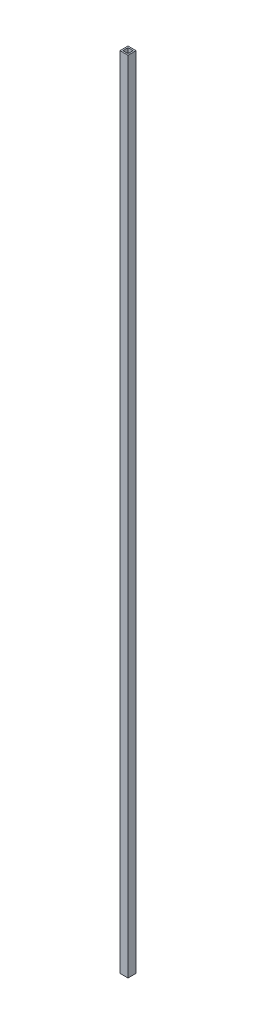
ISO-10303-21;
HEADER;
FILE_DESCRIPTION(('STEP AP214'),'2;1');
FILE_NAME('part.step','',(''),(''),'','','');
FILE_SCHEMA(('AUTOMOTIVE_DESIGN { 1 0 10303 214 1 1 1 1 }'));
ENDSEC;
DATA;
#1=APPLICATION_CONTEXT('core data for automotive mechanical design processes');
#2=APPLICATION_PROTOCOL_DEFINITION('international standard','automotive_design',2000,#1);
#3=PRODUCT_CONTEXT('',#1,'mechanical');
#4=PRODUCT('Part','Part','',(#3));
#5=PRODUCT_RELATED_PRODUCT_CATEGORY('part','',(#4));
#6=PRODUCT_DEFINITION_FORMATION('','',#4);
#7=PRODUCT_DEFINITION_CONTEXT('part definition',#1,'design');
#8=PRODUCT_DEFINITION('design','',#6,#7);
#9=PRODUCT_DEFINITION_SHAPE('','',#8);
#10=(LENGTH_UNIT() NAMED_UNIT(*) SI_UNIT(.MILLI.,.METRE.));
#11=(NAMED_UNIT(*) PLANE_ANGLE_UNIT() SI_UNIT($,.RADIAN.));
#12=(NAMED_UNIT(*) SI_UNIT($,.STERADIAN.) SOLID_ANGLE_UNIT());
#13=UNCERTAINTY_MEASURE_WITH_UNIT(LENGTH_MEASURE(1.E-05),#10,'distance_accuracy_value','');
#14=(GEOMETRIC_REPRESENTATION_CONTEXT(3) GLOBAL_UNCERTAINTY_ASSIGNED_CONTEXT((#13)) GLOBAL_UNIT_ASSIGNED_CONTEXT((#10,
#11,#12)) REPRESENTATION_CONTEXT('',''));
#15=CARTESIAN_POINT('',(0.,0.,0.));
#16=DIRECTION('',(0.,0.,1.));
#17=DIRECTION('',(1.,0.,0.));
#18=AXIS2_PLACEMENT_3D('',#15,#16,#17);
#19=CARTESIAN_POINT('',(0.,1000.,0.));
#20=DIRECTION('',(0.,1.,0.));
#21=DIRECTION('',(0.,0.,1.));
#22=AXIS2_PLACEMENT_3D('',#19,#20,#21);
#23=PLANE('',#22);
#24=DIRECTION('',(0.,0.,-1.));
#25=VECTOR('',#24,1.);
#26=CARTESIAN_POINT('',(5.,1000.,-5.));
#27=LINE('',#26,#25);
#28=CARTESIAN_POINT('',(5.,1000.,5.));
#29=VERTEX_POINT('',#28);
#30=CARTESIAN_POINT('',(5.,1000.,-5.));
#31=VERTEX_POINT('',#30);
#32=EDGE_CURVE('E153',#29,#31,#27,.T.);
#33=ORIENTED_EDGE('',*,*,#32,.T.);
#34=DIRECTION('',(-1.,0.,0.));
#35=VECTOR('',#34,1.);
#36=CARTESIAN_POINT('',(-5.,1000.,-5.));
#37=LINE('',#36,#35);
#38=CARTESIAN_POINT('',(-5.,1000.,-5.));
#39=VERTEX_POINT('',#38);
#40=EDGE_CURVE('E157',#31,#39,#37,.T.);
#41=ORIENTED_EDGE('',*,*,#40,.T.);
#42=DIRECTION('',(0.,0.,1.));
#43=VECTOR('',#42,1.);
#44=CARTESIAN_POINT('',(-5.,1000.,-5.));
#45=LINE('',#44,#43);
#46=CARTESIAN_POINT('',(-5.,1000.,5.));
#47=VERTEX_POINT('',#46);
#48=EDGE_CURVE('E161',#39,#47,#45,.T.);
#49=ORIENTED_EDGE('',*,*,#48,.T.);
#50=DIRECTION('',(1.,0.,0.));
#51=VECTOR('',#50,1.);
#52=CARTESIAN_POINT('',(-5.,1000.,5.));
#53=LINE('',#52,#51);
#54=EDGE_CURVE('E164',#47,#29,#53,.T.);
#55=ORIENTED_EDGE('',*,*,#54,.T.);
#56=EDGE_LOOP('',(#33,#41,#49,#55));
#57=FACE_BOUND('',#56,.T.);
#58=DIRECTION('',(-1.,0.,0.));
#59=VECTOR('',#58,1.);
#60=CARTESIAN_POINT('',(-3.2,1000.,-3.2));
#61=LINE('',#60,#59);
#62=CARTESIAN_POINT('',(3.2,1000.,-3.2));
#63=VERTEX_POINT('',#62);
#64=CARTESIAN_POINT('',(-3.2,1000.,-3.2));
#65=VERTEX_POINT('',#64);
#66=EDGE_CURVE('E114',#63,#65,#61,.T.);
#67=ORIENTED_EDGE('',*,*,#66,.F.);
#68=DIRECTION('',(0.,0.,-1.));
#69=VECTOR('',#68,1.);
#70=CARTESIAN_POINT('',(3.2,1000.,-3.2));
#71=LINE('',#70,#69);
#72=CARTESIAN_POINT('',(3.2,1000.,3.2));
#73=VERTEX_POINT('',#72);
#74=EDGE_CURVE('E105',#73,#63,#71,.T.);
#75=ORIENTED_EDGE('',*,*,#74,.F.);
#76=DIRECTION('',(1.,0.,0.));
#77=VECTOR('',#76,1.);
#78=CARTESIAN_POINT('',(-3.2,1000.,3.2));
#79=LINE('',#78,#77);
#80=CARTESIAN_POINT('',(-3.2,1000.,3.2));
#81=VERTEX_POINT('',#80);
#82=EDGE_CURVE('E131',#81,#73,#79,.T.);
#83=ORIENTED_EDGE('',*,*,#82,.F.);
#84=DIRECTION('',(0.,0.,1.));
#85=VECTOR('',#84,1.);
#86=CARTESIAN_POINT('',(-3.2,1000.,-3.2));
#87=LINE('',#86,#85);
#88=EDGE_CURVE('E127',#65,#81,#87,.T.);
#89=ORIENTED_EDGE('',*,*,#88,.F.);
#90=EDGE_LOOP('',(#67,#75,#83,#89));
#91=FACE_BOUND('',#90,.T.);
#92=ADVANCED_FACE('F39',(#57,#91),#23,.T.);
#93=CARTESIAN_POINT('',(0.,0.,0.));
#94=DIRECTION('',(0.,1.,0.));
#95=DIRECTION('',(0.,0.,1.));
#96=AXIS2_PLACEMENT_3D('',#93,#94,#95);
#97=PLANE('',#96);
#98=DIRECTION('',(0.,0.,-1.));
#99=VECTOR('',#98,1.);
#100=CARTESIAN_POINT('',(5.,0.,-5.));
#101=LINE('',#100,#99);
#102=CARTESIAN_POINT('',(5.,0.,5.));
#103=VERTEX_POINT('',#102);
#104=CARTESIAN_POINT('',(5.,0.,-5.));
#105=VERTEX_POINT('',#104);
#106=EDGE_CURVE('E123',#103,#105,#101,.T.);
#107=ORIENTED_EDGE('',*,*,#106,.F.);
#108=DIRECTION('',(1.,0.,0.));
#109=VECTOR('',#108,1.);
#110=CARTESIAN_POINT('',(-5.,0.,5.));
#111=LINE('',#110,#109);
#112=CARTESIAN_POINT('',(-5.,0.,5.));
#113=VERTEX_POINT('',#112);
#114=EDGE_CURVE('E158',#113,#103,#111,.T.);
#115=ORIENTED_EDGE('',*,*,#114,.F.);
#116=DIRECTION('',(0.,0.,1.));
#117=VECTOR('',#116,1.);
#118=CARTESIAN_POINT('',(-5.,0.,-5.));
#119=LINE('',#118,#117);
#120=CARTESIAN_POINT('',(-5.,0.,-5.));
#121=VERTEX_POINT('',#120);
#122=EDGE_CURVE('E174',#121,#113,#119,.T.);
#123=ORIENTED_EDGE('',*,*,#122,.F.);
#124=DIRECTION('',(-1.,0.,0.));
#125=VECTOR('',#124,1.);
#126=CARTESIAN_POINT('',(-5.,0.,-5.));
#127=LINE('',#126,#125);
#128=EDGE_CURVE('E171',#105,#121,#127,.T.);
#129=ORIENTED_EDGE('',*,*,#128,.F.);
#130=EDGE_LOOP('',(#107,#115,#123,#129));
#131=FACE_BOUND('',#130,.T.);
#132=DIRECTION('',(0.,0.,-1.));
#133=VECTOR('',#132,1.);
#134=CARTESIAN_POINT('',(3.2,0.,-3.2));
#135=LINE('',#134,#133);
#136=CARTESIAN_POINT('',(3.2,0.,3.2));
#137=VERTEX_POINT('',#136);
#138=CARTESIAN_POINT('',(3.2,0.,-3.2));
#139=VERTEX_POINT('',#138);
#140=EDGE_CURVE('E63',#137,#139,#135,.T.);
#141=ORIENTED_EDGE('',*,*,#140,.T.);
#142=DIRECTION('',(-1.,0.,0.));
#143=VECTOR('',#142,1.);
#144=CARTESIAN_POINT('',(-3.2,0.,-3.2));
#145=LINE('',#144,#143);
#146=CARTESIAN_POINT('',(-3.2,0.,-3.2));
#147=VERTEX_POINT('',#146);
#148=EDGE_CURVE('E121',#139,#147,#145,.T.);
#149=ORIENTED_EDGE('',*,*,#148,.T.);
#150=DIRECTION('',(0.,0.,1.));
#151=VECTOR('',#150,1.);
#152=CARTESIAN_POINT('',(-3.2,0.,-3.2));
#153=LINE('',#152,#151);
#154=CARTESIAN_POINT('',(-3.2,0.,3.2));
#155=VERTEX_POINT('',#154);
#156=EDGE_CURVE('E140',#147,#155,#153,.T.);
#157=ORIENTED_EDGE('',*,*,#156,.T.);
#158=DIRECTION('',(1.,0.,0.));
#159=VECTOR('',#158,1.);
#160=CARTESIAN_POINT('',(-3.2,0.,3.2));
#161=LINE('',#160,#159);
#162=EDGE_CURVE('E115',#155,#137,#161,.T.);
#163=ORIENTED_EDGE('',*,*,#162,.T.);
#164=EDGE_LOOP('',(#141,#149,#157,#163));
#165=FACE_BOUND('',#164,.T.);
#166=ADVANCED_FACE('F197',(#131,#165),#97,.F.);
#167=CARTESIAN_POINT('',(5.,1000.,-5.));
#168=DIRECTION('',(-1.,0.,0.));
#169=DIRECTION('',(0.,0.,1.));
#170=AXIS2_PLACEMENT_3D('',#167,#168,#169);
#171=PLANE('',#170);
#172=ORIENTED_EDGE('',*,*,#106,.T.);
#173=DIRECTION('',(0.,-1.,0.));
#174=VECTOR('',#173,1.);
#175=CARTESIAN_POINT('',(5.,1000.,-5.));
#176=LINE('',#175,#174);
#177=EDGE_CURVE('E11',#31,#105,#176,.T.);
#178=ORIENTED_EDGE('',*,*,#177,.F.);
#179=ORIENTED_EDGE('',*,*,#32,.F.);
#180=DIRECTION('',(0.,-1.,0.));
#181=VECTOR('',#180,1.);
#182=CARTESIAN_POINT('',(5.,1000.,5.));
#183=LINE('',#182,#181);
#184=EDGE_CURVE('E167',#29,#103,#183,.T.);
#185=ORIENTED_EDGE('',*,*,#184,.T.);
#186=EDGE_LOOP('',(#172,#178,#179,#185));
#187=FACE_BOUND('',#186,.T.);
#188=ADVANCED_FACE('F41',(#187),#171,.F.);
#189=CARTESIAN_POINT('',(-5.,1000.,-5.));
#190=DIRECTION('',(0.,0.,1.));
#191=DIRECTION('',(1.,0.,0.));
#192=AXIS2_PLACEMENT_3D('',#189,#190,#191);
#193=PLANE('',#192);
#194=ORIENTED_EDGE('',*,*,#128,.T.);
#195=DIRECTION('',(0.,-1.,0.));
#196=VECTOR('',#195,1.);
#197=CARTESIAN_POINT('',(-5.,1000.,-5.));
#198=LINE('',#197,#196);
#199=EDGE_CURVE('E48',#39,#121,#198,.T.);
#200=ORIENTED_EDGE('',*,*,#199,.F.);
#201=ORIENTED_EDGE('',*,*,#40,.F.);
#202=ORIENTED_EDGE('',*,*,#177,.T.);
#203=EDGE_LOOP('',(#194,#200,#201,#202));
#204=FACE_BOUND('',#203,.T.);
#205=ADVANCED_FACE('F207',(#204),#193,.F.);
#206=CARTESIAN_POINT('',(-5.,1000.,-5.));
#207=DIRECTION('',(1.,0.,0.));
#208=DIRECTION('',(0.,0.,-1.));
#209=AXIS2_PLACEMENT_3D('',#206,#207,#208);
#210=PLANE('',#209);
#211=ORIENTED_EDGE('',*,*,#122,.T.);
#212=DIRECTION('',(0.,-1.,0.));
#213=VECTOR('',#212,1.);
#214=CARTESIAN_POINT('',(-5.,1000.,5.));
#215=LINE('',#214,#213);
#216=EDGE_CURVE('E182',#47,#113,#215,.T.);
#217=ORIENTED_EDGE('',*,*,#216,.F.);
#218=ORIENTED_EDGE('',*,*,#48,.F.);
#219=ORIENTED_EDGE('',*,*,#199,.T.);
#220=EDGE_LOOP('',(#211,#217,#218,#219));
#221=FACE_BOUND('',#220,.T.);
#222=ADVANCED_FACE('F191',(#221),#210,.F.);
#223=CARTESIAN_POINT('',(-5.,1000.,5.));
#224=DIRECTION('',(0.,0.,-1.));
#225=DIRECTION('',(-1.,0.,0.));
#226=AXIS2_PLACEMENT_3D('',#223,#224,#225);
#227=PLANE('',#226);
#228=ORIENTED_EDGE('',*,*,#114,.T.);
#229=ORIENTED_EDGE('',*,*,#184,.F.);
#230=ORIENTED_EDGE('',*,*,#54,.F.);
#231=ORIENTED_EDGE('',*,*,#216,.T.);
#232=EDGE_LOOP('',(#228,#229,#230,#231));
#233=FACE_BOUND('',#232,.T.);
#234=ADVANCED_FACE('F201',(#233),#227,.F.);
#235=CARTESIAN_POINT('',(3.2,1000.,-3.2));
#236=DIRECTION('',(-1.,0.,0.));
#237=DIRECTION('',(0.,0.,1.));
#238=AXIS2_PLACEMENT_3D('',#235,#236,#237);
#239=PLANE('',#238);
#240=ORIENTED_EDGE('',*,*,#140,.F.);
#241=DIRECTION('',(0.,-1.,0.));
#242=VECTOR('',#241,1.);
#243=CARTESIAN_POINT('',(3.2,1000.,3.2));
#244=LINE('',#243,#242);
#245=EDGE_CURVE('E109',#73,#137,#244,.T.);
#246=ORIENTED_EDGE('',*,*,#245,.F.);
#247=ORIENTED_EDGE('',*,*,#74,.T.);
#248=DIRECTION('',(0.,-1.,0.));
#249=VECTOR('',#248,1.);
#250=CARTESIAN_POINT('',(3.2,1000.,-3.2));
#251=LINE('',#250,#249);
#252=EDGE_CURVE('E108',#63,#139,#251,.T.);
#253=ORIENTED_EDGE('',*,*,#252,.T.);
#254=EDGE_LOOP('',(#240,#246,#247,#253));
#255=FACE_BOUND('',#254,.T.);
#256=ADVANCED_FACE('F107',(#255),#239,.T.);
#257=CARTESIAN_POINT('',(-3.2,1000.,-3.2));
#258=DIRECTION('',(0.,0.,1.));
#259=DIRECTION('',(1.,0.,0.));
#260=AXIS2_PLACEMENT_3D('',#257,#258,#259);
#261=PLANE('',#260);
#262=ORIENTED_EDGE('',*,*,#148,.F.);
#263=ORIENTED_EDGE('',*,*,#252,.F.);
#264=ORIENTED_EDGE('',*,*,#66,.T.);
#265=DIRECTION('',(0.,-1.,0.));
#266=VECTOR('',#265,1.);
#267=CARTESIAN_POINT('',(-3.2,1000.,-3.2));
#268=LINE('',#267,#266);
#269=EDGE_CURVE('E124',#65,#147,#268,.T.);
#270=ORIENTED_EDGE('',*,*,#269,.T.);
#271=EDGE_LOOP('',(#262,#263,#264,#270));
#272=FACE_BOUND('',#271,.T.);
#273=ADVANCED_FACE('F118',(#272),#261,.T.);
#274=CARTESIAN_POINT('',(-3.2,1000.,-3.2));
#275=DIRECTION('',(1.,0.,0.));
#276=DIRECTION('',(0.,0.,-1.));
#277=AXIS2_PLACEMENT_3D('',#274,#275,#276);
#278=PLANE('',#277);
#279=ORIENTED_EDGE('',*,*,#156,.F.);
#280=ORIENTED_EDGE('',*,*,#269,.F.);
#281=ORIENTED_EDGE('',*,*,#88,.T.);
#282=DIRECTION('',(0.,-1.,0.));
#283=VECTOR('',#282,1.);
#284=CARTESIAN_POINT('',(-3.2,1000.,3.2));
#285=LINE('',#284,#283);
#286=EDGE_CURVE('E55',#81,#155,#285,.T.);
#287=ORIENTED_EDGE('',*,*,#286,.T.);
#288=EDGE_LOOP('',(#279,#280,#281,#287));
#289=FACE_BOUND('',#288,.T.);
#290=ADVANCED_FACE('F230',(#289),#278,.T.);
#291=CARTESIAN_POINT('',(-3.2,1000.,3.2));
#292=DIRECTION('',(0.,0.,-1.));
#293=DIRECTION('',(-1.,0.,0.));
#294=AXIS2_PLACEMENT_3D('',#291,#292,#293);
#295=PLANE('',#294);
#296=ORIENTED_EDGE('',*,*,#162,.F.);
#297=ORIENTED_EDGE('',*,*,#286,.F.);
#298=ORIENTED_EDGE('',*,*,#82,.T.);
#299=ORIENTED_EDGE('',*,*,#245,.T.);
#300=EDGE_LOOP('',(#296,#297,#298,#299));
#301=FACE_BOUND('',#300,.T.);
#302=ADVANCED_FACE('F234',(#301),#295,.T.);
#303=CLOSED_SHELL('',(#92,#166,#188,#205,#222,#234,#256,#273,#290,#302));
#304=MANIFOLD_SOLID_BREP('B2',#303);
#305=ADVANCED_BREP_SHAPE_REPRESENTATION('',(#18,#304),#14);
#306=SHAPE_DEFINITION_REPRESENTATION(#9,#305);
ENDSEC;
END-ISO-10303-21;
